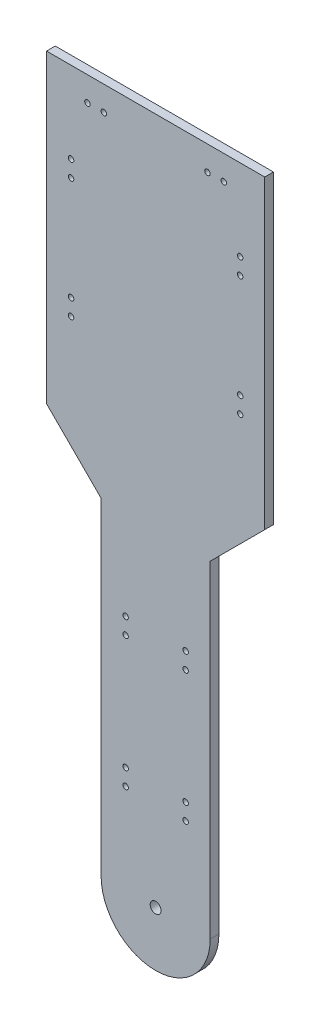
ISO-10303-21;
HEADER;
FILE_DESCRIPTION(('STEP AP214'),'2;1');
FILE_NAME('part.step','',(''),(''),'','','');
FILE_SCHEMA(('AUTOMOTIVE_DESIGN { 1 0 10303 214 1 1 1 1 }'));
ENDSEC;
DATA;
#1=APPLICATION_CONTEXT('core data for automotive mechanical design processes');
#2=APPLICATION_PROTOCOL_DEFINITION('international standard','automotive_design',2000,#1);
#3=PRODUCT_CONTEXT('',#1,'mechanical');
#4=PRODUCT('Part','Part','',(#3));
#5=PRODUCT_RELATED_PRODUCT_CATEGORY('part','',(#4));
#6=PRODUCT_DEFINITION_FORMATION('','',#4);
#7=PRODUCT_DEFINITION_CONTEXT('part definition',#1,'design');
#8=PRODUCT_DEFINITION('design','',#6,#7);
#9=PRODUCT_DEFINITION_SHAPE('','',#8);
#10=(LENGTH_UNIT() NAMED_UNIT(*) SI_UNIT(.MILLI.,.METRE.));
#11=(NAMED_UNIT(*) PLANE_ANGLE_UNIT() SI_UNIT($,.RADIAN.));
#12=(NAMED_UNIT(*) SI_UNIT($,.STERADIAN.) SOLID_ANGLE_UNIT());
#13=UNCERTAINTY_MEASURE_WITH_UNIT(LENGTH_MEASURE(1.E-05),#10,'distance_accuracy_value','');
#14=(GEOMETRIC_REPRESENTATION_CONTEXT(3) GLOBAL_UNCERTAINTY_ASSIGNED_CONTEXT((#13)) GLOBAL_UNIT_ASSIGNED_CONTEXT((#10,
#11,#12)) REPRESENTATION_CONTEXT('',''));
#15=CARTESIAN_POINT('',(0.,0.,0.));
#16=DIRECTION('',(0.,0.,1.));
#17=DIRECTION('',(1.,0.,0.));
#18=AXIS2_PLACEMENT_3D('',#15,#16,#17);
#19=CARTESIAN_POINT('',(1.27356325489975E-13,-530.,8.));
#20=DIRECTION('',(0.,0.,1.));
#21=DIRECTION('',(1.,0.,0.));
#22=AXIS2_PLACEMENT_3D('',#19,#20,#21);
#23=PLANE('',#22);
#24=CARTESIAN_POINT('',(27.5000000000038,-447.500000000005,7.99999999999908));
#25=DIRECTION('',(0.,0.,1.));
#26=DIRECTION('',(-1.,0.,0.));
#27=AXIS2_PLACEMENT_3D('',#24,#25,#26);
#28=CIRCLE('',#27,2.50000000000002);
#29=CARTESIAN_POINT('',(25.0000000000037,-447.500000000005,7.99999999999908));
#30=VERTEX_POINT('',#29);
#31=EDGE_CURVE('E303',#30,#30,#28,.T.);
#32=ORIENTED_EDGE('',*,*,#31,.F.);
#33=EDGE_LOOP('',(#32));
#34=FACE_BOUND('',#33,.T.);
#35=CARTESIAN_POINT('',(27.5000000000037,-432.500000000005,7.99999999999906));
#36=DIRECTION('',(0.,0.,1.));
#37=DIRECTION('',(-1.,0.,0.));
#38=AXIS2_PLACEMENT_3D('',#35,#36,#37);
#39=CIRCLE('',#38,2.49999999999997);
#40=CARTESIAN_POINT('',(25.0000000000038,-432.500000000005,7.99999999999906));
#41=VERTEX_POINT('',#40);
#42=EDGE_CURVE('E297',#41,#41,#39,.T.);
#43=ORIENTED_EDGE('',*,*,#42,.F.);
#44=EDGE_LOOP('',(#43));
#45=FACE_BOUND('',#44,.T.);
#46=CARTESIAN_POINT('',(77.5000000000024,-84.5000000000026,7.99999999999908));
#47=DIRECTION('',(0.,0.,1.));
#48=DIRECTION('',(-1.,0.,0.));
#49=AXIS2_PLACEMENT_3D('',#46,#47,#48);
#50=CIRCLE('',#49,2.50000000000005);
#51=CARTESIAN_POINT('',(75.0000000000024,-84.5000000000026,7.99999999999908));
#52=VERTEX_POINT('',#51);
#53=EDGE_CURVE('E291',#52,#52,#50,.T.);
#54=ORIENTED_EDGE('',*,*,#53,.F.);
#55=EDGE_LOOP('',(#54));
#56=FACE_BOUND('',#55,.T.);
#57=CARTESIAN_POINT('',(77.5000000000024,-99.5000000000026,7.9999999999991));
#58=DIRECTION('',(0.,0.,1.));
#59=DIRECTION('',(-1.,0.,0.));
#60=AXIS2_PLACEMENT_3D('',#57,#58,#59);
#61=CIRCLE('',#60,2.49999999999994);
#62=CARTESIAN_POINT('',(75.0000000000025,-99.5000000000026,7.9999999999991));
#63=VERTEX_POINT('',#62);
#64=EDGE_CURVE('E285',#63,#63,#61,.T.);
#65=ORIENTED_EDGE('',*,*,#64,.F.);
#66=EDGE_LOOP('',(#65));
#67=FACE_BOUND('',#66,.T.);
#68=CARTESIAN_POINT('',(-27.4999999999957,-432.500000000004,7.99999999999906));
#69=DIRECTION('',(0.,0.,1.));
#70=DIRECTION('',(-1.,0.,0.));
#71=AXIS2_PLACEMENT_3D('',#68,#69,#70);
#72=CIRCLE('',#71,2.49999999999997);
#73=CARTESIAN_POINT('',(-29.9999999999957,-432.500000000004,7.99999999999906));
#74=VERTEX_POINT('',#73);
#75=EDGE_CURVE('E274',#74,#74,#72,.T.);
#76=ORIENTED_EDGE('',*,*,#75,.F.);
#77=EDGE_LOOP('',(#76));
#78=FACE_BOUND('',#77,.T.);
#79=CARTESIAN_POINT('',(-27.4999999999956,-447.500000000004,7.99999999999908));
#80=DIRECTION('',(0.,0.,1.));
#81=DIRECTION('',(-1.,0.,0.));
#82=AXIS2_PLACEMENT_3D('',#79,#80,#81);
#83=CIRCLE('',#82,2.50000000000004);
#84=CARTESIAN_POINT('',(-29.9999999999957,-447.500000000004,7.99999999999908));
#85=VERTEX_POINT('',#84);
#86=EDGE_CURVE('E268',#85,#85,#83,.T.);
#87=ORIENTED_EDGE('',*,*,#86,.F.);
#88=EDGE_LOOP('',(#87));
#89=FACE_BOUND('',#88,.T.);
#90=CARTESIAN_POINT('',(-27.4999999999958,-327.499999999996,7.999999999999));
#91=DIRECTION('',(0.,0.,-1.));
#92=DIRECTION('',(-1.,0.,0.));
#93=AXIS2_PLACEMENT_3D('',#90,#91,#92);
#94=CIRCLE('',#93,2.49999999999997);
#95=CARTESIAN_POINT('',(-29.9999999999958,-327.499999999996,7.999999999999));
#96=VERTEX_POINT('',#95);
#97=EDGE_CURVE('E262',#96,#96,#94,.T.);
#98=ORIENTED_EDGE('',*,*,#97,.T.);
#99=EDGE_LOOP('',(#98));
#100=FACE_BOUND('',#99,.T.);
#101=CARTESIAN_POINT('',(-27.4999999999958,-312.499999999996,7.999999999999));
#102=DIRECTION('',(0.,0.,-1.));
#103=DIRECTION('',(-1.,0.,0.));
#104=AXIS2_PLACEMENT_3D('',#101,#102,#103);
#105=CIRCLE('',#104,2.50000000000004);
#106=CARTESIAN_POINT('',(-29.9999999999958,-312.499999999996,7.999999999999));
#107=VERTEX_POINT('',#106);
#108=EDGE_CURVE('E256',#107,#107,#105,.T.);
#109=ORIENTED_EDGE('',*,*,#108,.T.);
#110=EDGE_LOOP('',(#109));
#111=FACE_BOUND('',#110,.T.);
#112=CARTESIAN_POINT('',(-77.4999999999967,-84.5000000000027,7.99999999999908));
#113=DIRECTION('',(0.,0.,1.));
#114=DIRECTION('',(-1.,0.,0.));
#115=AXIS2_PLACEMENT_3D('',#112,#113,#114);
#116=CIRCLE('',#115,2.49999999999997);
#117=CARTESIAN_POINT('',(-79.9999999999966,-84.5000000000027,7.99999999999908));
#118=VERTEX_POINT('',#117);
#119=EDGE_CURVE('E250',#118,#118,#116,.T.);
#120=ORIENTED_EDGE('',*,*,#119,.F.);
#121=EDGE_LOOP('',(#120));
#122=FACE_BOUND('',#121,.T.);
#123=CARTESIAN_POINT('',(-77.4999999999966,-99.5000000000027,7.9999999999991));
#124=DIRECTION('',(0.,0.,1.));
#125=DIRECTION('',(-1.,0.,0.));
#126=AXIS2_PLACEMENT_3D('',#123,#124,#125);
#127=CIRCLE('',#126,2.50000000000001);
#128=CARTESIAN_POINT('',(-79.9999999999966,-99.5000000000027,7.9999999999991));
#129=VERTEX_POINT('',#128);
#130=EDGE_CURVE('E244',#129,#129,#127,.T.);
#131=ORIENTED_EDGE('',*,*,#130,.F.);
#132=EDGE_LOOP('',(#131));
#133=FACE_BOUND('',#132,.T.);
#134=CARTESIAN_POINT('',(-77.4999999999967,10.5000000000063,7.999999999999));
#135=DIRECTION('',(0.,0.,-1.));
#136=DIRECTION('',(-1.,0.,0.));
#137=AXIS2_PLACEMENT_3D('',#134,#135,#136);
#138=CIRCLE('',#137,2.49999999999997);
#139=CARTESIAN_POINT('',(-79.9999999999967,10.5000000000063,7.999999999999));
#140=VERTEX_POINT('',#139);
#141=EDGE_CURVE('E238',#140,#140,#138,.T.);
#142=ORIENTED_EDGE('',*,*,#141,.T.);
#143=EDGE_LOOP('',(#142));
#144=FACE_BOUND('',#143,.T.);
#145=CARTESIAN_POINT('',(-77.4999999999966,25.5000000000064,7.999999999999));
#146=DIRECTION('',(0.,0.,-1.));
#147=DIRECTION('',(-1.,0.,0.));
#148=AXIS2_PLACEMENT_3D('',#145,#146,#147);
#149=CIRCLE('',#148,2.50000000000001);
#150=CARTESIAN_POINT('',(-79.9999999999966,25.5000000000064,7.999999999999));
#151=VERTEX_POINT('',#150);
#152=EDGE_CURVE('E232',#151,#151,#149,.T.);
#153=ORIENTED_EDGE('',*,*,#152,.T.);
#154=EDGE_LOOP('',(#153));
#155=FACE_BOUND('',#154,.T.);
#156=CARTESIAN_POINT('',(-62.4999999999976,77.5000000000064,7.999999999999));
#157=DIRECTION('',(0.,0.,-1.));
#158=DIRECTION('',(-1.,0.,0.));
#159=AXIS2_PLACEMENT_3D('',#156,#157,#158);
#160=CIRCLE('',#159,2.50000000000004);
#161=CARTESIAN_POINT('',(-64.9999999999976,77.5000000000064,7.999999999999));
#162=VERTEX_POINT('',#161);
#163=EDGE_CURVE('E226',#162,#162,#160,.T.);
#164=ORIENTED_EDGE('',*,*,#163,.T.);
#165=EDGE_LOOP('',(#164));
#166=FACE_BOUND('',#165,.T.);
#167=CARTESIAN_POINT('',(-47.4999999999977,77.5000000000065,7.999999999999));
#168=DIRECTION('',(0.,0.,-1.));
#169=DIRECTION('',(-1.,0.,0.));
#170=AXIS2_PLACEMENT_3D('',#167,#168,#169);
#171=CIRCLE('',#170,2.49999999999997);
#172=CARTESIAN_POINT('',(-49.9999999999976,77.5000000000065,7.999999999999));
#173=VERTEX_POINT('',#172);
#174=EDGE_CURVE('E220',#173,#173,#171,.T.);
#175=ORIENTED_EDGE('',*,*,#174,.T.);
#176=EDGE_LOOP('',(#175));
#177=FACE_BOUND('',#176,.T.);
#178=CARTESIAN_POINT('',(27.5000000000036,-312.499999999994,7.999999999999));
#179=DIRECTION('',(0.,0.,-1.));
#180=DIRECTION('',(-1.,0.,0.));
#181=AXIS2_PLACEMENT_3D('',#178,#179,#180);
#182=CIRCLE('',#181,2.50000000000002);
#183=CARTESIAN_POINT('',(25.0000000000036,-312.499999999994,7.999999999999));
#184=VERTEX_POINT('',#183);
#185=EDGE_CURVE('E214',#184,#184,#182,.T.);
#186=ORIENTED_EDGE('',*,*,#185,.T.);
#187=EDGE_LOOP('',(#186));
#188=FACE_BOUND('',#187,.T.);
#189=CARTESIAN_POINT('',(27.5000000000036,-327.499999999994,7.999999999999));
#190=DIRECTION('',(0.,0.,-1.));
#191=DIRECTION('',(-1.,0.,0.));
#192=AXIS2_PLACEMENT_3D('',#189,#190,#191);
#193=CIRCLE('',#192,2.49999999999997);
#194=CARTESIAN_POINT('',(25.0000000000037,-327.499999999994,7.999999999999));
#195=VERTEX_POINT('',#194);
#196=EDGE_CURVE('E208',#195,#195,#193,.T.);
#197=ORIENTED_EDGE('',*,*,#196,.T.);
#198=EDGE_LOOP('',(#197));
#199=FACE_BOUND('',#198,.T.);
#200=CARTESIAN_POINT('',(77.5000000000024,10.5000000000063,7.999999999999));
#201=DIRECTION('',(0.,0.,-1.));
#202=DIRECTION('',(-1.,0.,0.));
#203=AXIS2_PLACEMENT_3D('',#200,#201,#202);
#204=CIRCLE('',#203,2.50000000000005);
#205=CARTESIAN_POINT('',(75.0000000000023,10.5000000000063,7.999999999999));
#206=VERTEX_POINT('',#205);
#207=EDGE_CURVE('E202',#206,#206,#204,.T.);
#208=ORIENTED_EDGE('',*,*,#207,.T.);
#209=EDGE_LOOP('',(#208));
#210=FACE_BOUND('',#209,.T.);
#211=CARTESIAN_POINT('',(77.5000000000024,25.5000000000064,7.999999999999));
#212=DIRECTION('',(0.,0.,-1.));
#213=DIRECTION('',(-1.,0.,0.));
#214=AXIS2_PLACEMENT_3D('',#211,#212,#213);
#215=CIRCLE('',#214,2.49999999999994);
#216=CARTESIAN_POINT('',(75.0000000000025,25.5000000000064,7.999999999999));
#217=VERTEX_POINT('',#216);
#218=EDGE_CURVE('E196',#217,#217,#215,.T.);
#219=ORIENTED_EDGE('',*,*,#218,.T.);
#220=EDGE_LOOP('',(#219));
#221=FACE_BOUND('',#220,.T.);
#222=CARTESIAN_POINT('',(47.5000000000039,77.5000000000053,7.999999999999));
#223=DIRECTION('',(0.,0.,-1.));
#224=DIRECTION('',(-1.,0.,0.));
#225=AXIS2_PLACEMENT_3D('',#222,#223,#224);
#226=CIRCLE('',#225,2.49999999999997);
#227=CARTESIAN_POINT('',(45.000000000004,77.5000000000053,7.999999999999));
#228=VERTEX_POINT('',#227);
#229=EDGE_CURVE('E190',#228,#228,#226,.T.);
#230=ORIENTED_EDGE('',*,*,#229,.T.);
#231=EDGE_LOOP('',(#230));
#232=FACE_BOUND('',#231,.T.);
#233=CARTESIAN_POINT('',(62.5000000000038,77.5000000000053,7.999999999999));
#234=DIRECTION('',(0.,0.,-1.));
#235=DIRECTION('',(-1.,0.,0.));
#236=AXIS2_PLACEMENT_3D('',#233,#234,#235);
#237=CIRCLE('',#236,2.49999999999997);
#238=CARTESIAN_POINT('',(60.0000000000039,77.5000000000053,7.999999999999));
#239=VERTEX_POINT('',#238);
#240=EDGE_CURVE('E184',#239,#239,#237,.T.);
#241=ORIENTED_EDGE('',*,*,#240,.T.);
#242=EDGE_LOOP('',(#241));
#243=FACE_BOUND('',#242,.T.);
#244=DIRECTION('',(0.,-1.,0.));
#245=VECTOR('',#244,1.);
#246=CARTESIAN_POINT('',(-100.,100.,8.));
#247=LINE('',#246,#245);
#248=CARTESIAN_POINT('',(-100.,100.,8.));
#249=VERTEX_POINT('',#248);
#250=CARTESIAN_POINT('',(-99.9999999999999,-180.,8.));
#251=VERTEX_POINT('',#250);
#252=EDGE_CURVE('E92',#249,#251,#247,.T.);
#253=ORIENTED_EDGE('',*,*,#252,.T.);
#254=DIRECTION('',(0.707106781186549,-0.707106781186546,0.));
#255=VECTOR('',#254,1.);
#256=CARTESIAN_POINT('',(-99.9999999999999,-180.,8.));
#257=LINE('',#256,#255);
#258=CARTESIAN_POINT('',(-50.,-230.,8.));
#259=VERTEX_POINT('',#258);
#260=EDGE_CURVE('E178',#251,#259,#257,.T.);
#261=ORIENTED_EDGE('',*,*,#260,.T.);
#262=DIRECTION('',(0.,-1.,0.));
#263=VECTOR('',#262,1.);
#264=CARTESIAN_POINT('',(-50.,-230.,8.));
#265=LINE('',#264,#263);
#266=CARTESIAN_POINT('',(-49.9999999999999,-530.,8.));
#267=VERTEX_POINT('',#266);
#268=EDGE_CURVE('E161',#259,#267,#265,.T.);
#269=ORIENTED_EDGE('',*,*,#268,.T.);
#270=CARTESIAN_POINT('',(1.27356325489975E-13,-530.,8.));
#271=DIRECTION('',(0.,0.,1.));
#272=DIRECTION('',(1.,0.,0.));
#273=AXIS2_PLACEMENT_3D('',#270,#271,#272);
#274=CIRCLE('',#273,49.9999999999999);
#275=CARTESIAN_POINT('',(50.,-530.,8.));
#276=VERTEX_POINT('',#275);
#277=EDGE_CURVE('E174',#267,#276,#274,.T.);
#278=ORIENTED_EDGE('',*,*,#277,.T.);
#279=DIRECTION('',(0.,1.,0.));
#280=VECTOR('',#279,1.);
#281=CARTESIAN_POINT('',(49.9999999999999,-230.,8.));
#282=LINE('',#281,#280);
#283=CARTESIAN_POINT('',(49.9999999999999,-230.,8.));
#284=VERTEX_POINT('',#283);
#285=EDGE_CURVE('E112',#276,#284,#282,.T.);
#286=ORIENTED_EDGE('',*,*,#285,.T.);
#287=DIRECTION('',(0.707106781186549,0.707106781186546,0.));
#288=VECTOR('',#287,1.);
#289=CARTESIAN_POINT('',(100.,-180.,8.));
#290=LINE('',#289,#288);
#291=CARTESIAN_POINT('',(100.,-180.,8.));
#292=VERTEX_POINT('',#291);
#293=EDGE_CURVE('E106',#284,#292,#290,.T.);
#294=ORIENTED_EDGE('',*,*,#293,.T.);
#295=DIRECTION('',(0.,1.,0.));
#296=VECTOR('',#295,1.);
#297=CARTESIAN_POINT('',(100.,0.,8.));
#298=LINE('',#297,#296);
#299=CARTESIAN_POINT('',(100.,100.,8.));
#300=VERTEX_POINT('',#299);
#301=EDGE_CURVE('E110',#292,#300,#298,.T.);
#302=ORIENTED_EDGE('',*,*,#301,.T.);
#303=DIRECTION('',(-1.,0.,0.));
#304=VECTOR('',#303,1.);
#305=CARTESIAN_POINT('',(-100.,100.,8.));
#306=LINE('',#305,#304);
#307=EDGE_CURVE('E51',#300,#249,#306,.T.);
#308=ORIENTED_EDGE('',*,*,#307,.T.);
#309=EDGE_LOOP('',(#253,#261,#269,#278,#286,#294,#302,#308));
#310=FACE_BOUND('',#309,.T.);
#311=CARTESIAN_POINT('',(1.27356325489975E-13,-530.,8.));
#312=DIRECTION('',(0.,0.,1.));
#313=DIRECTION('',(1.,0.,0.));
#314=AXIS2_PLACEMENT_3D('',#311,#312,#313);
#315=CIRCLE('',#314,5.);
#316=CARTESIAN_POINT('',(5.00000000000013,-530.,8.));
#317=VERTEX_POINT('',#316);
#318=EDGE_CURVE('E133',#317,#317,#315,.T.);
#319=ORIENTED_EDGE('',*,*,#318,.F.);
#320=EDGE_LOOP('',(#319));
#321=FACE_BOUND('',#320,.T.);
#322=ADVANCED_FACE('F34',(#34,#45,#56,#67,#78,#89,#100,#111,#122,#133,#144,#155,#166,#177,#188,
#199,#210,#221,#232,#243,#310,#321),#23,.T.);
#323=CARTESIAN_POINT('',(1.27356325489975E-13,-530.,0.));
#324=DIRECTION('',(0.,0.,1.));
#325=DIRECTION('',(1.,0.,0.));
#326=AXIS2_PLACEMENT_3D('',#323,#324,#325);
#327=PLANE('',#326);
#328=CARTESIAN_POINT('',(27.5000000000038,-447.500000000005,-9.16649688174876E-13));
#329=DIRECTION('',(0.,0.,1.));
#330=DIRECTION('',(-1.,0.,0.));
#331=AXIS2_PLACEMENT_3D('',#328,#329,#330);
#332=CIRCLE('',#331,2.50000000000002);
#333=CARTESIAN_POINT('',(25.0000000000037,-447.500000000005,-9.16649688174876E-13));
#334=VERTEX_POINT('',#333);
#335=EDGE_CURVE('E300',#334,#334,#332,.T.);
#336=ORIENTED_EDGE('',*,*,#335,.T.);
#337=EDGE_LOOP('',(#336));
#338=FACE_BOUND('',#337,.T.);
#339=CARTESIAN_POINT('',(27.5000000000037,-432.500000000005,-9.34994362394378E-13));
#340=DIRECTION('',(0.,0.,1.));
#341=DIRECTION('',(-1.,0.,0.));
#342=AXIS2_PLACEMENT_3D('',#339,#340,#341);
#343=CIRCLE('',#342,2.49999999999997);
#344=CARTESIAN_POINT('',(25.0000000000038,-432.500000000005,-9.34994362394378E-13));
#345=VERTEX_POINT('',#344);
#346=EDGE_CURVE('E294',#345,#345,#343,.T.);
#347=ORIENTED_EDGE('',*,*,#346,.T.);
#348=EDGE_LOOP('',(#347));
#349=FACE_BOUND('',#348,.T.);
#350=CARTESIAN_POINT('',(77.5000000000024,-84.5000000000026,-9.21558102653945E-13));
#351=DIRECTION('',(0.,0.,1.));
#352=DIRECTION('',(-1.,0.,0.));
#353=AXIS2_PLACEMENT_3D('',#350,#351,#352);
#354=CIRCLE('',#353,2.50000000000005);
#355=CARTESIAN_POINT('',(75.0000000000024,-84.5000000000026,-9.21558102653945E-13));
#356=VERTEX_POINT('',#355);
#357=EDGE_CURVE('E288',#356,#356,#354,.T.);
#358=ORIENTED_EDGE('',*,*,#357,.T.);
#359=EDGE_LOOP('',(#358));
#360=FACE_BOUND('',#359,.T.);
#361=CARTESIAN_POINT('',(77.5000000000024,-99.5000000000026,-8.97039380703833E-13));
#362=DIRECTION('',(0.,0.,1.));
#363=DIRECTION('',(-1.,0.,0.));
#364=AXIS2_PLACEMENT_3D('',#361,#362,#363);
#365=CIRCLE('',#364,2.49999999999994);
#366=CARTESIAN_POINT('',(75.0000000000025,-99.5000000000026,-8.97039380703833E-13));
#367=VERTEX_POINT('',#366);
#368=EDGE_CURVE('E280',#367,#367,#365,.T.);
#369=ORIENTED_EDGE('',*,*,#368,.T.);
#370=EDGE_LOOP('',(#369));
#371=FACE_BOUND('',#370,.T.);
#372=CARTESIAN_POINT('',(-27.4999999999957,-432.500000000004,-9.34994362394379E-13));
#373=DIRECTION('',(0.,0.,1.));
#374=DIRECTION('',(-1.,0.,0.));
#375=AXIS2_PLACEMENT_3D('',#372,#373,#374);
#376=CIRCLE('',#375,2.49999999999997);
#377=CARTESIAN_POINT('',(-29.9999999999957,-432.500000000004,-9.34994362394379E-13));
#378=VERTEX_POINT('',#377);
#379=EDGE_CURVE('E277',#378,#378,#376,.T.);
#380=ORIENTED_EDGE('',*,*,#379,.T.);
#381=EDGE_LOOP('',(#380));
#382=FACE_BOUND('',#381,.T.);
#383=CARTESIAN_POINT('',(-27.4999999999956,-447.500000000004,-9.16649688174878E-13));
#384=DIRECTION('',(0.,0.,1.));
#385=DIRECTION('',(-1.,0.,0.));
#386=AXIS2_PLACEMENT_3D('',#383,#384,#385);
#387=CIRCLE('',#386,2.50000000000004);
#388=CARTESIAN_POINT('',(-29.9999999999957,-447.500000000004,-9.16649688174878E-13));
#389=VERTEX_POINT('',#388);
#390=EDGE_CURVE('E271',#389,#389,#387,.T.);
#391=ORIENTED_EDGE('',*,*,#390,.T.);
#392=EDGE_LOOP('',(#391));
#393=FACE_BOUND('',#392,.T.);
#394=CARTESIAN_POINT('',(-27.4999999999958,-327.499999999996,-9.99200722162641E-13));
#395=DIRECTION('',(0.,0.,-1.));
#396=DIRECTION('',(-1.,0.,0.));
#397=AXIS2_PLACEMENT_3D('',#394,#395,#396);
#398=CIRCLE('',#397,2.49999999999997);
#399=CARTESIAN_POINT('',(-29.9999999999958,-327.499999999996,-9.99200722162641E-13));
#400=VERTEX_POINT('',#399);
#401=EDGE_CURVE('E265',#400,#400,#398,.T.);
#402=ORIENTED_EDGE('',*,*,#401,.F.);
#403=EDGE_LOOP('',(#402));
#404=FACE_BOUND('',#403,.T.);
#405=CARTESIAN_POINT('',(-27.4999999999958,-312.499999999996,-9.99200722162641E-13));
#406=DIRECTION('',(0.,0.,-1.));
#407=DIRECTION('',(-1.,0.,0.));
#408=AXIS2_PLACEMENT_3D('',#405,#406,#407);
#409=CIRCLE('',#408,2.50000000000004);
#410=CARTESIAN_POINT('',(-29.9999999999958,-312.499999999996,-9.99200722162641E-13));
#411=VERTEX_POINT('',#410);
#412=EDGE_CURVE('E259',#411,#411,#409,.T.);
#413=ORIENTED_EDGE('',*,*,#412,.F.);
#414=EDGE_LOOP('',(#413));
#415=FACE_BOUND('',#414,.T.);
#416=CARTESIAN_POINT('',(-77.4999999999967,-84.5000000000027,-9.21558102653945E-13));
#417=DIRECTION('',(0.,0.,1.));
#418=DIRECTION('',(-1.,0.,0.));
#419=AXIS2_PLACEMENT_3D('',#416,#417,#418);
#420=CIRCLE('',#419,2.49999999999997);
#421=CARTESIAN_POINT('',(-79.9999999999966,-84.5000000000027,-9.21558102653945E-13));
#422=VERTEX_POINT('',#421);
#423=EDGE_CURVE('E253',#422,#422,#420,.T.);
#424=ORIENTED_EDGE('',*,*,#423,.T.);
#425=EDGE_LOOP('',(#424));
#426=FACE_BOUND('',#425,.T.);
#427=CARTESIAN_POINT('',(-77.4999999999966,-99.5000000000027,-8.97039380703833E-13));
#428=DIRECTION('',(0.,0.,1.));
#429=DIRECTION('',(-1.,0.,0.));
#430=AXIS2_PLACEMENT_3D('',#427,#428,#429);
#431=CIRCLE('',#430,2.50000000000001);
#432=CARTESIAN_POINT('',(-79.9999999999966,-99.5000000000027,-8.97039380703833E-13));
#433=VERTEX_POINT('',#432);
#434=EDGE_CURVE('E247',#433,#433,#431,.T.);
#435=ORIENTED_EDGE('',*,*,#434,.T.);
#436=EDGE_LOOP('',(#435));
#437=FACE_BOUND('',#436,.T.);
#438=CARTESIAN_POINT('',(-77.4999999999967,10.5000000000063,-9.99200722162641E-13));
#439=DIRECTION('',(0.,0.,-1.));
#440=DIRECTION('',(-1.,0.,0.));
#441=AXIS2_PLACEMENT_3D('',#438,#439,#440);
#442=CIRCLE('',#441,2.49999999999997);
#443=CARTESIAN_POINT('',(-79.9999999999967,10.5000000000063,-9.99200722162641E-13));
#444=VERTEX_POINT('',#443);
#445=EDGE_CURVE('E241',#444,#444,#442,.T.);
#446=ORIENTED_EDGE('',*,*,#445,.F.);
#447=EDGE_LOOP('',(#446));
#448=FACE_BOUND('',#447,.T.);
#449=CARTESIAN_POINT('',(-77.4999999999966,25.5000000000064,-9.99200722162641E-13));
#450=DIRECTION('',(0.,0.,-1.));
#451=DIRECTION('',(-1.,0.,0.));
#452=AXIS2_PLACEMENT_3D('',#449,#450,#451);
#453=CIRCLE('',#452,2.50000000000001);
#454=CARTESIAN_POINT('',(-79.9999999999966,25.5000000000064,-9.99200722162641E-13));
#455=VERTEX_POINT('',#454);
#456=EDGE_CURVE('E235',#455,#455,#453,.T.);
#457=ORIENTED_EDGE('',*,*,#456,.F.);
#458=EDGE_LOOP('',(#457));
#459=FACE_BOUND('',#458,.T.);
#460=CARTESIAN_POINT('',(-62.4999999999976,77.5000000000064,-9.99200722162641E-13));
#461=DIRECTION('',(0.,0.,-1.));
#462=DIRECTION('',(-1.,0.,0.));
#463=AXIS2_PLACEMENT_3D('',#460,#461,#462);
#464=CIRCLE('',#463,2.50000000000004);
#465=CARTESIAN_POINT('',(-64.9999999999976,77.5000000000064,-9.99200722162641E-13));
#466=VERTEX_POINT('',#465);
#467=EDGE_CURVE('E229',#466,#466,#464,.T.);
#468=ORIENTED_EDGE('',*,*,#467,.F.);
#469=EDGE_LOOP('',(#468));
#470=FACE_BOUND('',#469,.T.);
#471=CARTESIAN_POINT('',(-47.4999999999977,77.5000000000065,-9.99200722162641E-13));
#472=DIRECTION('',(0.,0.,-1.));
#473=DIRECTION('',(-1.,0.,0.));
#474=AXIS2_PLACEMENT_3D('',#471,#472,#473);
#475=CIRCLE('',#474,2.49999999999997);
#476=CARTESIAN_POINT('',(-49.9999999999976,77.5000000000065,-9.99200722162641E-13));
#477=VERTEX_POINT('',#476);
#478=EDGE_CURVE('E223',#477,#477,#475,.T.);
#479=ORIENTED_EDGE('',*,*,#478,.F.);
#480=EDGE_LOOP('',(#479));
#481=FACE_BOUND('',#480,.T.);
#482=CARTESIAN_POINT('',(27.5000000000036,-312.499999999994,-9.99200722162641E-13));
#483=DIRECTION('',(0.,0.,-1.));
#484=DIRECTION('',(-1.,0.,0.));
#485=AXIS2_PLACEMENT_3D('',#482,#483,#484);
#486=CIRCLE('',#485,2.50000000000002);
#487=CARTESIAN_POINT('',(25.0000000000036,-312.499999999994,-9.99200722162641E-13));
#488=VERTEX_POINT('',#487);
#489=EDGE_CURVE('E217',#488,#488,#486,.T.);
#490=ORIENTED_EDGE('',*,*,#489,.F.);
#491=EDGE_LOOP('',(#490));
#492=FACE_BOUND('',#491,.T.);
#493=CARTESIAN_POINT('',(27.5000000000036,-327.499999999994,-9.99200722162641E-13));
#494=DIRECTION('',(0.,0.,-1.));
#495=DIRECTION('',(-1.,0.,0.));
#496=AXIS2_PLACEMENT_3D('',#493,#494,#495);
#497=CIRCLE('',#496,2.49999999999997);
#498=CARTESIAN_POINT('',(25.0000000000037,-327.499999999994,-9.99200722162641E-13));
#499=VERTEX_POINT('',#498);
#500=EDGE_CURVE('E211',#499,#499,#497,.T.);
#501=ORIENTED_EDGE('',*,*,#500,.F.);
#502=EDGE_LOOP('',(#501));
#503=FACE_BOUND('',#502,.T.);
#504=CARTESIAN_POINT('',(77.5000000000024,10.5000000000063,-9.99200722162641E-13));
#505=DIRECTION('',(0.,0.,-1.));
#506=DIRECTION('',(-1.,0.,0.));
#507=AXIS2_PLACEMENT_3D('',#504,#505,#506);
#508=CIRCLE('',#507,2.50000000000005);
#509=CARTESIAN_POINT('',(75.0000000000023,10.5000000000063,-9.99200722162641E-13));
#510=VERTEX_POINT('',#509);
#511=EDGE_CURVE('E205',#510,#510,#508,.T.);
#512=ORIENTED_EDGE('',*,*,#511,.F.);
#513=EDGE_LOOP('',(#512));
#514=FACE_BOUND('',#513,.T.);
#515=CARTESIAN_POINT('',(77.5000000000024,25.5000000000064,-9.99200722162641E-13));
#516=DIRECTION('',(0.,0.,-1.));
#517=DIRECTION('',(-1.,0.,0.));
#518=AXIS2_PLACEMENT_3D('',#515,#516,#517);
#519=CIRCLE('',#518,2.49999999999994);
#520=CARTESIAN_POINT('',(75.0000000000025,25.5000000000064,-9.99200722162641E-13));
#521=VERTEX_POINT('',#520);
#522=EDGE_CURVE('E199',#521,#521,#519,.T.);
#523=ORIENTED_EDGE('',*,*,#522,.F.);
#524=EDGE_LOOP('',(#523));
#525=FACE_BOUND('',#524,.T.);
#526=CARTESIAN_POINT('',(47.5000000000039,77.5000000000053,-9.99200722162641E-13));
#527=DIRECTION('',(0.,0.,-1.));
#528=DIRECTION('',(-1.,0.,0.));
#529=AXIS2_PLACEMENT_3D('',#526,#527,#528);
#530=CIRCLE('',#529,2.49999999999997);
#531=CARTESIAN_POINT('',(45.000000000004,77.5000000000053,-9.99200722162641E-13));
#532=VERTEX_POINT('',#531);
#533=EDGE_CURVE('E193',#532,#532,#530,.T.);
#534=ORIENTED_EDGE('',*,*,#533,.F.);
#535=EDGE_LOOP('',(#534));
#536=FACE_BOUND('',#535,.T.);
#537=CARTESIAN_POINT('',(62.5000000000038,77.5000000000053,-9.99200722162641E-13));
#538=DIRECTION('',(0.,0.,-1.));
#539=DIRECTION('',(-1.,0.,0.));
#540=AXIS2_PLACEMENT_3D('',#537,#538,#539);
#541=CIRCLE('',#540,2.49999999999997);
#542=CARTESIAN_POINT('',(60.0000000000039,77.5000000000053,-9.99200722162641E-13));
#543=VERTEX_POINT('',#542);
#544=EDGE_CURVE('E187',#543,#543,#541,.T.);
#545=ORIENTED_EDGE('',*,*,#544,.F.);
#546=EDGE_LOOP('',(#545));
#547=FACE_BOUND('',#546,.T.);
#548=DIRECTION('',(0.,-1.,0.));
#549=VECTOR('',#548,1.);
#550=CARTESIAN_POINT('',(-99.9999999999999,0.,0.));
#551=LINE('',#550,#549);
#552=CARTESIAN_POINT('',(-100.,100.,0.));
#553=VERTEX_POINT('',#552);
#554=CARTESIAN_POINT('',(-99.9999999999999,-180.,0.));
#555=VERTEX_POINT('',#554);
#556=EDGE_CURVE('E86',#553,#555,#551,.T.);
#557=ORIENTED_EDGE('',*,*,#556,.F.);
#558=DIRECTION('',(-1.,0.,0.));
#559=VECTOR('',#558,1.);
#560=CARTESIAN_POINT('',(-100.,100.,0.));
#561=LINE('',#560,#559);
#562=CARTESIAN_POINT('',(100.,100.,0.));
#563=VERTEX_POINT('',#562);
#564=EDGE_CURVE('E143',#563,#553,#561,.T.);
#565=ORIENTED_EDGE('',*,*,#564,.F.);
#566=DIRECTION('',(0.,1.,0.));
#567=VECTOR('',#566,1.);
#568=CARTESIAN_POINT('',(100.,100.,0.));
#569=LINE('',#568,#567);
#570=CARTESIAN_POINT('',(100.,-180.,0.));
#571=VERTEX_POINT('',#570);
#572=EDGE_CURVE('E79',#571,#563,#569,.T.);
#573=ORIENTED_EDGE('',*,*,#572,.F.);
#574=DIRECTION('',(0.707106781186549,0.707106781186546,0.));
#575=VECTOR('',#574,1.);
#576=CARTESIAN_POINT('',(100.,-180.,0.));
#577=LINE('',#576,#575);
#578=CARTESIAN_POINT('',(49.9999999999999,-230.,0.));
#579=VERTEX_POINT('',#578);
#580=EDGE_CURVE('E121',#579,#571,#577,.T.);
#581=ORIENTED_EDGE('',*,*,#580,.F.);
#582=DIRECTION('',(0.,1.,0.));
#583=VECTOR('',#582,1.);
#584=CARTESIAN_POINT('',(49.9999999999999,-230.,0.));
#585=LINE('',#584,#583);
#586=CARTESIAN_POINT('',(50.,-530.,0.));
#587=VERTEX_POINT('',#586);
#588=EDGE_CURVE('E139',#587,#579,#585,.T.);
#589=ORIENTED_EDGE('',*,*,#588,.F.);
#590=CARTESIAN_POINT('',(1.27356325489975E-13,-530.,0.));
#591=DIRECTION('',(0.,0.,1.));
#592=DIRECTION('',(1.,0.,0.));
#593=AXIS2_PLACEMENT_3D('',#590,#591,#592);
#594=CIRCLE('',#593,49.9999999999999);
#595=CARTESIAN_POINT('',(-49.9999999999999,-530.,0.));
#596=VERTEX_POINT('',#595);
#597=EDGE_CURVE('E137',#596,#587,#594,.T.);
#598=ORIENTED_EDGE('',*,*,#597,.F.);
#599=DIRECTION('',(0.,-1.,0.));
#600=VECTOR('',#599,1.);
#601=CARTESIAN_POINT('',(-50.,-230.,0.));
#602=LINE('',#601,#600);
#603=CARTESIAN_POINT('',(-50.,-230.,0.));
#604=VERTEX_POINT('',#603);
#605=EDGE_CURVE('E135',#604,#596,#602,.T.);
#606=ORIENTED_EDGE('',*,*,#605,.F.);
#607=DIRECTION('',(0.707106781186549,-0.707106781186546,0.));
#608=VECTOR('',#607,1.);
#609=CARTESIAN_POINT('',(-99.9999999999999,-180.,0.));
#610=LINE('',#609,#608);
#611=EDGE_CURVE('E132',#555,#604,#610,.T.);
#612=ORIENTED_EDGE('',*,*,#611,.F.);
#613=EDGE_LOOP('',(#557,#565,#573,#581,#589,#598,#606,#612));
#614=FACE_BOUND('',#613,.T.);
#615=CARTESIAN_POINT('',(1.27356325489975E-13,-530.,0.));
#616=DIRECTION('',(0.,0.,1.));
#617=DIRECTION('',(1.,0.,0.));
#618=AXIS2_PLACEMENT_3D('',#615,#616,#617);
#619=CIRCLE('',#618,5.);
#620=CARTESIAN_POINT('',(5.00000000000013,-530.,0.));
#621=VERTEX_POINT('',#620);
#622=EDGE_CURVE('E181',#621,#621,#619,.T.);
#623=ORIENTED_EDGE('',*,*,#622,.T.);
#624=EDGE_LOOP('',(#623));
#625=FACE_BOUND('',#624,.T.);
#626=ADVANCED_FACE('F165',(#338,#349,#360,#371,#382,#393,#404,#415,#426,#437,#448,#459,#470,
#481,#492,#503,#514,#525,#536,#547,#614,#625),#327,.F.);
#627=CARTESIAN_POINT('',(-99.9999999999999,0.,8.));
#628=DIRECTION('',(1.,0.,0.));
#629=DIRECTION('',(0.,1.,0.));
#630=AXIS2_PLACEMENT_3D('',#627,#628,#629);
#631=PLANE('',#630);
#632=ORIENTED_EDGE('',*,*,#556,.T.);
#633=DIRECTION('',(0.,0.,-1.));
#634=VECTOR('',#633,1.);
#635=CARTESIAN_POINT('',(-99.9999999999999,-180.,8.));
#636=LINE('',#635,#634);
#637=EDGE_CURVE('E11',#251,#555,#636,.T.);
#638=ORIENTED_EDGE('',*,*,#637,.F.);
#639=ORIENTED_EDGE('',*,*,#252,.F.);
#640=DIRECTION('',(0.,0.,-1.));
#641=VECTOR('',#640,1.);
#642=CARTESIAN_POINT('',(-100.,100.,8.));
#643=LINE('',#642,#641);
#644=EDGE_CURVE('E127',#249,#553,#643,.T.);
#645=ORIENTED_EDGE('',*,*,#644,.T.);
#646=EDGE_LOOP('',(#632,#638,#639,#645));
#647=FACE_BOUND('',#646,.T.);
#648=ADVANCED_FACE('F36',(#647),#631,.F.);
#649=CARTESIAN_POINT('',(-99.9999999999999,-180.,8.));
#650=DIRECTION('',(0.707106781186546,0.707106781186549,0.));
#651=DIRECTION('',(-0.707106781186549,0.707106781186546,0.));
#652=AXIS2_PLACEMENT_3D('',#649,#650,#651);
#653=PLANE('',#652);
#654=ORIENTED_EDGE('',*,*,#611,.T.);
#655=DIRECTION('',(0.,0.,-1.));
#656=VECTOR('',#655,1.);
#657=CARTESIAN_POINT('',(-50.,-230.,8.));
#658=LINE('',#657,#656);
#659=EDGE_CURVE('E43',#259,#604,#658,.T.);
#660=ORIENTED_EDGE('',*,*,#659,.F.);
#661=ORIENTED_EDGE('',*,*,#260,.F.);
#662=ORIENTED_EDGE('',*,*,#637,.T.);
#663=EDGE_LOOP('',(#654,#660,#661,#662));
#664=FACE_BOUND('',#663,.T.);
#665=ADVANCED_FACE('F365',(#664),#653,.F.);
#666=CARTESIAN_POINT('',(-50.,-230.,8.));
#667=DIRECTION('',(1.,0.,0.));
#668=DIRECTION('',(0.,1.,0.));
#669=AXIS2_PLACEMENT_3D('',#666,#667,#668);
#670=PLANE('',#669);
#671=ORIENTED_EDGE('',*,*,#605,.T.);
#672=DIRECTION('',(0.,0.,-1.));
#673=VECTOR('',#672,1.);
#674=CARTESIAN_POINT('',(-49.9999999999999,-530.,8.));
#675=LINE('',#674,#673);
#676=EDGE_CURVE('E152',#267,#596,#675,.T.);
#677=ORIENTED_EDGE('',*,*,#676,.F.);
#678=ORIENTED_EDGE('',*,*,#268,.F.);
#679=ORIENTED_EDGE('',*,*,#659,.T.);
#680=EDGE_LOOP('',(#671,#677,#678,#679));
#681=FACE_BOUND('',#680,.T.);
#682=ADVANCED_FACE('F159',(#681),#670,.F.);
#683=CARTESIAN_POINT('',(1.27356325489975E-13,-530.,8.));
#684=DIRECTION('',(0.,0.,-1.));
#685=DIRECTION('',(-1.,0.,0.));
#686=AXIS2_PLACEMENT_3D('',#683,#684,#685);
#687=CYLINDRICAL_SURFACE('',#686,49.9999999999999);
#688=ORIENTED_EDGE('',*,*,#597,.T.);
#689=DIRECTION('',(0.,0.,-1.));
#690=VECTOR('',#689,1.);
#691=CARTESIAN_POINT('',(50.,-530.,8.));
#692=LINE('',#691,#690);
#693=EDGE_CURVE('E149',#276,#587,#692,.T.);
#694=ORIENTED_EDGE('',*,*,#693,.F.);
#695=ORIENTED_EDGE('',*,*,#277,.F.);
#696=ORIENTED_EDGE('',*,*,#676,.T.);
#697=EDGE_LOOP('',(#688,#694,#695,#696));
#698=FACE_BOUND('',#697,.T.);
#699=ADVANCED_FACE('F170',(#698),#687,.T.);
#700=CARTESIAN_POINT('',(49.9999999999999,-230.,8.));
#701=DIRECTION('',(-1.,0.,0.));
#702=DIRECTION('',(0.,-1.,0.));
#703=AXIS2_PLACEMENT_3D('',#700,#701,#702);
#704=PLANE('',#703);
#705=ORIENTED_EDGE('',*,*,#588,.T.);
#706=DIRECTION('',(0.,0.,-1.));
#707=VECTOR('',#706,1.);
#708=CARTESIAN_POINT('',(49.9999999999999,-230.,8.));
#709=LINE('',#708,#707);
#710=EDGE_CURVE('E122',#284,#579,#709,.T.);
#711=ORIENTED_EDGE('',*,*,#710,.F.);
#712=ORIENTED_EDGE('',*,*,#285,.F.);
#713=ORIENTED_EDGE('',*,*,#693,.T.);
#714=EDGE_LOOP('',(#705,#711,#712,#713));
#715=FACE_BOUND('',#714,.T.);
#716=ADVANCED_FACE('F173',(#715),#704,.F.);
#717=CARTESIAN_POINT('',(100.,-180.,8.));
#718=DIRECTION('',(-0.707106781186546,0.707106781186549,0.));
#719=DIRECTION('',(-0.707106781186549,-0.707106781186546,0.));
#720=AXIS2_PLACEMENT_3D('',#717,#718,#719);
#721=PLANE('',#720);
#722=ORIENTED_EDGE('',*,*,#580,.T.);
#723=DIRECTION('',(0.,0.,-1.));
#724=VECTOR('',#723,1.);
#725=CARTESIAN_POINT('',(100.,-180.,8.));
#726=LINE('',#725,#724);
#727=EDGE_CURVE('E118',#292,#571,#726,.T.);
#728=ORIENTED_EDGE('',*,*,#727,.F.);
#729=ORIENTED_EDGE('',*,*,#293,.F.);
#730=ORIENTED_EDGE('',*,*,#710,.T.);
#731=EDGE_LOOP('',(#722,#728,#729,#730));
#732=FACE_BOUND('',#731,.T.);
#733=ADVANCED_FACE('F119',(#732),#721,.F.);
#734=CARTESIAN_POINT('',(100.,100.,8.));
#735=DIRECTION('',(-1.,0.,0.));
#736=DIRECTION('',(0.,0.,1.));
#737=AXIS2_PLACEMENT_3D('',#734,#735,#736);
#738=PLANE('',#737);
#739=ORIENTED_EDGE('',*,*,#572,.T.);
#740=DIRECTION('',(0.,0.,-1.));
#741=VECTOR('',#740,1.);
#742=CARTESIAN_POINT('',(100.,100.,8.));
#743=LINE('',#742,#741);
#744=EDGE_CURVE('E123',#300,#563,#743,.T.);
#745=ORIENTED_EDGE('',*,*,#744,.F.);
#746=ORIENTED_EDGE('',*,*,#301,.F.);
#747=ORIENTED_EDGE('',*,*,#727,.T.);
#748=EDGE_LOOP('',(#739,#745,#746,#747));
#749=FACE_BOUND('',#748,.T.);
#750=ADVANCED_FACE('F125',(#749),#738,.F.);
#751=CARTESIAN_POINT('',(-100.,100.,8.));
#752=DIRECTION('',(0.,-1.,0.));
#753=DIRECTION('',(1.,0.,0.));
#754=AXIS2_PLACEMENT_3D('',#751,#752,#753);
#755=PLANE('',#754);
#756=ORIENTED_EDGE('',*,*,#564,.T.);
#757=ORIENTED_EDGE('',*,*,#644,.F.);
#758=ORIENTED_EDGE('',*,*,#307,.F.);
#759=ORIENTED_EDGE('',*,*,#744,.T.);
#760=EDGE_LOOP('',(#756,#757,#758,#759));
#761=FACE_BOUND('',#760,.T.);
#762=ADVANCED_FACE('F370',(#761),#755,.F.);
#763=CARTESIAN_POINT('',(1.27356325489975E-13,-530.,8.));
#764=DIRECTION('',(0.,0.,-1.));
#765=DIRECTION('',(-1.,0.,0.));
#766=AXIS2_PLACEMENT_3D('',#763,#764,#765);
#767=CYLINDRICAL_SURFACE('',#766,5.);
#768=ORIENTED_EDGE('',*,*,#318,.T.);
#769=EDGE_LOOP('',(#768));
#770=FACE_BOUND('',#769,.T.);
#771=ORIENTED_EDGE('',*,*,#622,.F.);
#772=EDGE_LOOP('',(#771));
#773=FACE_BOUND('',#772,.T.);
#774=ADVANCED_FACE('F355',(#770,#773),#767,.F.);
#775=CARTESIAN_POINT('',(62.5000000000038,77.5000000000053,7.999999999999));
#776=DIRECTION('',(0.,0.,-1.));
#777=DIRECTION('',(-1.,0.,0.));
#778=AXIS2_PLACEMENT_3D('',#775,#776,#777);
#779=CYLINDRICAL_SURFACE('',#778,2.49999999999997);
#780=ORIENTED_EDGE('',*,*,#240,.F.);
#781=EDGE_LOOP('',(#780));
#782=FACE_BOUND('',#781,.T.);
#783=ORIENTED_EDGE('',*,*,#544,.T.);
#784=EDGE_LOOP('',(#783));
#785=FACE_BOUND('',#784,.T.);
#786=ADVANCED_FACE('F351',(#782,#785),#779,.F.);
#787=CARTESIAN_POINT('',(47.5000000000039,77.5000000000053,7.999999999999));
#788=DIRECTION('',(0.,0.,-1.));
#789=DIRECTION('',(-1.,0.,0.));
#790=AXIS2_PLACEMENT_3D('',#787,#788,#789);
#791=CYLINDRICAL_SURFACE('',#790,2.49999999999997);
#792=ORIENTED_EDGE('',*,*,#229,.F.);
#793=EDGE_LOOP('',(#792));
#794=FACE_BOUND('',#793,.T.);
#795=ORIENTED_EDGE('',*,*,#533,.T.);
#796=EDGE_LOOP('',(#795));
#797=FACE_BOUND('',#796,.T.);
#798=ADVANCED_FACE('F354',(#794,#797),#791,.F.);
#799=CARTESIAN_POINT('',(77.5000000000024,25.5000000000064,7.999999999999));
#800=DIRECTION('',(0.,0.,-1.));
#801=DIRECTION('',(-1.,0.,0.));
#802=AXIS2_PLACEMENT_3D('',#799,#800,#801);
#803=CYLINDRICAL_SURFACE('',#802,2.49999999999994);
#804=ORIENTED_EDGE('',*,*,#218,.F.);
#805=EDGE_LOOP('',(#804));
#806=FACE_BOUND('',#805,.T.);
#807=ORIENTED_EDGE('',*,*,#522,.T.);
#808=EDGE_LOOP('',(#807));
#809=FACE_BOUND('',#808,.T.);
#810=ADVANCED_FACE('F428',(#806,#809),#803,.F.);
#811=CARTESIAN_POINT('',(77.5000000000024,10.5000000000063,7.999999999999));
#812=DIRECTION('',(0.,0.,-1.));
#813=DIRECTION('',(-1.,0.,0.));
#814=AXIS2_PLACEMENT_3D('',#811,#812,#813);
#815=CYLINDRICAL_SURFACE('',#814,2.50000000000005);
#816=ORIENTED_EDGE('',*,*,#207,.F.);
#817=EDGE_LOOP('',(#816));
#818=FACE_BOUND('',#817,.T.);
#819=ORIENTED_EDGE('',*,*,#511,.T.);
#820=EDGE_LOOP('',(#819));
#821=FACE_BOUND('',#820,.T.);
#822=ADVANCED_FACE('F436',(#818,#821),#815,.F.);
#823=CARTESIAN_POINT('',(27.5000000000036,-327.499999999994,7.999999999999));
#824=DIRECTION('',(0.,0.,-1.));
#825=DIRECTION('',(-1.,0.,0.));
#826=AXIS2_PLACEMENT_3D('',#823,#824,#825);
#827=CYLINDRICAL_SURFACE('',#826,2.49999999999997);
#828=ORIENTED_EDGE('',*,*,#196,.F.);
#829=EDGE_LOOP('',(#828));
#830=FACE_BOUND('',#829,.T.);
#831=ORIENTED_EDGE('',*,*,#500,.T.);
#832=EDGE_LOOP('',(#831));
#833=FACE_BOUND('',#832,.T.);
#834=ADVANCED_FACE('F444',(#830,#833),#827,.F.);
#835=CARTESIAN_POINT('',(27.5000000000036,-312.499999999994,7.999999999999));
#836=DIRECTION('',(0.,0.,-1.));
#837=DIRECTION('',(-1.,0.,0.));
#838=AXIS2_PLACEMENT_3D('',#835,#836,#837);
#839=CYLINDRICAL_SURFACE('',#838,2.50000000000002);
#840=ORIENTED_EDGE('',*,*,#185,.F.);
#841=EDGE_LOOP('',(#840));
#842=FACE_BOUND('',#841,.T.);
#843=ORIENTED_EDGE('',*,*,#489,.T.);
#844=EDGE_LOOP('',(#843));
#845=FACE_BOUND('',#844,.T.);
#846=ADVANCED_FACE('F452',(#842,#845),#839,.F.);
#847=CARTESIAN_POINT('',(-47.4999999999977,77.5000000000065,7.999999999999));
#848=DIRECTION('',(0.,0.,-1.));
#849=DIRECTION('',(-1.,0.,0.));
#850=AXIS2_PLACEMENT_3D('',#847,#848,#849);
#851=CYLINDRICAL_SURFACE('',#850,2.49999999999997);
#852=ORIENTED_EDGE('',*,*,#174,.F.);
#853=EDGE_LOOP('',(#852));
#854=FACE_BOUND('',#853,.T.);
#855=ORIENTED_EDGE('',*,*,#478,.T.);
#856=EDGE_LOOP('',(#855));
#857=FACE_BOUND('',#856,.T.);
#858=ADVANCED_FACE('F460',(#854,#857),#851,.F.);
#859=CARTESIAN_POINT('',(-62.4999999999976,77.5000000000064,7.999999999999));
#860=DIRECTION('',(0.,0.,-1.));
#861=DIRECTION('',(-1.,0.,0.));
#862=AXIS2_PLACEMENT_3D('',#859,#860,#861);
#863=CYLINDRICAL_SURFACE('',#862,2.50000000000004);
#864=ORIENTED_EDGE('',*,*,#163,.F.);
#865=EDGE_LOOP('',(#864));
#866=FACE_BOUND('',#865,.T.);
#867=ORIENTED_EDGE('',*,*,#467,.T.);
#868=EDGE_LOOP('',(#867));
#869=FACE_BOUND('',#868,.T.);
#870=ADVANCED_FACE('F468',(#866,#869),#863,.F.);
#871=CARTESIAN_POINT('',(-77.4999999999966,25.5000000000064,7.999999999999));
#872=DIRECTION('',(0.,0.,-1.));
#873=DIRECTION('',(-1.,0.,0.));
#874=AXIS2_PLACEMENT_3D('',#871,#872,#873);
#875=CYLINDRICAL_SURFACE('',#874,2.50000000000001);
#876=ORIENTED_EDGE('',*,*,#152,.F.);
#877=EDGE_LOOP('',(#876));
#878=FACE_BOUND('',#877,.T.);
#879=ORIENTED_EDGE('',*,*,#456,.T.);
#880=EDGE_LOOP('',(#879));
#881=FACE_BOUND('',#880,.T.);
#882=ADVANCED_FACE('F476',(#878,#881),#875,.F.);
#883=CARTESIAN_POINT('',(-77.4999999999967,10.5000000000063,7.999999999999));
#884=DIRECTION('',(0.,0.,-1.));
#885=DIRECTION('',(-1.,0.,0.));
#886=AXIS2_PLACEMENT_3D('',#883,#884,#885);
#887=CYLINDRICAL_SURFACE('',#886,2.49999999999997);
#888=ORIENTED_EDGE('',*,*,#141,.F.);
#889=EDGE_LOOP('',(#888));
#890=FACE_BOUND('',#889,.T.);
#891=ORIENTED_EDGE('',*,*,#445,.T.);
#892=EDGE_LOOP('',(#891));
#893=FACE_BOUND('',#892,.T.);
#894=ADVANCED_FACE('F484',(#890,#893),#887,.F.);
#895=CARTESIAN_POINT('',(-77.4999999999966,-99.5000000000027,7.9999999999991));
#896=DIRECTION('',(0.,0.,-1.));
#897=DIRECTION('',(0.,1.,0.));
#898=AXIS2_PLACEMENT_3D('',#895,#896,#897);
#899=CYLINDRICAL_SURFACE('',#898,2.50000000000001);
#900=ORIENTED_EDGE('',*,*,#130,.T.);
#901=EDGE_LOOP('',(#900));
#902=FACE_BOUND('',#901,.T.);
#903=ORIENTED_EDGE('',*,*,#434,.F.);
#904=EDGE_LOOP('',(#903));
#905=FACE_BOUND('',#904,.T.);
#906=ADVANCED_FACE('F492',(#902,#905),#899,.F.);
#907=CARTESIAN_POINT('',(-77.4999999999967,-84.5000000000027,7.99999999999908));
#908=DIRECTION('',(0.,0.,-1.));
#909=DIRECTION('',(0.,1.,0.));
#910=AXIS2_PLACEMENT_3D('',#907,#908,#909);
#911=CYLINDRICAL_SURFACE('',#910,2.49999999999997);
#912=ORIENTED_EDGE('',*,*,#119,.T.);
#913=EDGE_LOOP('',(#912));
#914=FACE_BOUND('',#913,.T.);
#915=ORIENTED_EDGE('',*,*,#423,.F.);
#916=EDGE_LOOP('',(#915));
#917=FACE_BOUND('',#916,.T.);
#918=ADVANCED_FACE('F500',(#914,#917),#911,.F.);
#919=CARTESIAN_POINT('',(-27.4999999999958,-312.499999999996,7.999999999999));
#920=DIRECTION('',(0.,0.,-1.));
#921=DIRECTION('',(-1.,0.,0.));
#922=AXIS2_PLACEMENT_3D('',#919,#920,#921);
#923=CYLINDRICAL_SURFACE('',#922,2.50000000000004);
#924=ORIENTED_EDGE('',*,*,#108,.F.);
#925=EDGE_LOOP('',(#924));
#926=FACE_BOUND('',#925,.T.);
#927=ORIENTED_EDGE('',*,*,#412,.T.);
#928=EDGE_LOOP('',(#927));
#929=FACE_BOUND('',#928,.T.);
#930=ADVANCED_FACE('F508',(#926,#929),#923,.F.);
#931=CARTESIAN_POINT('',(-27.4999999999958,-327.499999999996,7.999999999999));
#932=DIRECTION('',(0.,0.,-1.));
#933=DIRECTION('',(-1.,0.,0.));
#934=AXIS2_PLACEMENT_3D('',#931,#932,#933);
#935=CYLINDRICAL_SURFACE('',#934,2.49999999999997);
#936=ORIENTED_EDGE('',*,*,#97,.F.);
#937=EDGE_LOOP('',(#936));
#938=FACE_BOUND('',#937,.T.);
#939=ORIENTED_EDGE('',*,*,#401,.T.);
#940=EDGE_LOOP('',(#939));
#941=FACE_BOUND('',#940,.T.);
#942=ADVANCED_FACE('F516',(#938,#941),#935,.F.);
#943=CARTESIAN_POINT('',(-27.4999999999956,-447.500000000004,7.99999999999908));
#944=DIRECTION('',(0.,0.,-1.));
#945=DIRECTION('',(0.,1.,0.));
#946=AXIS2_PLACEMENT_3D('',#943,#944,#945);
#947=CYLINDRICAL_SURFACE('',#946,2.50000000000004);
#948=ORIENTED_EDGE('',*,*,#86,.T.);
#949=EDGE_LOOP('',(#948));
#950=FACE_BOUND('',#949,.T.);
#951=ORIENTED_EDGE('',*,*,#390,.F.);
#952=EDGE_LOOP('',(#951));
#953=FACE_BOUND('',#952,.T.);
#954=ADVANCED_FACE('F524',(#950,#953),#947,.F.);
#955=CARTESIAN_POINT('',(-27.4999999999957,-432.500000000004,7.99999999999906));
#956=DIRECTION('',(0.,0.,-1.));
#957=DIRECTION('',(0.,1.,0.));
#958=AXIS2_PLACEMENT_3D('',#955,#956,#957);
#959=CYLINDRICAL_SURFACE('',#958,2.49999999999997);
#960=ORIENTED_EDGE('',*,*,#75,.T.);
#961=EDGE_LOOP('',(#960));
#962=FACE_BOUND('',#961,.T.);
#963=ORIENTED_EDGE('',*,*,#379,.F.);
#964=EDGE_LOOP('',(#963));
#965=FACE_BOUND('',#964,.T.);
#966=ADVANCED_FACE('F532',(#962,#965),#959,.F.);
#967=CARTESIAN_POINT('',(77.5000000000024,-99.5000000000026,7.9999999999991));
#968=DIRECTION('',(0.,0.,-1.));
#969=DIRECTION('',(-1.,0.,0.));
#970=AXIS2_PLACEMENT_3D('',#967,#968,#969);
#971=CYLINDRICAL_SURFACE('',#970,2.49999999999994);
#972=ORIENTED_EDGE('',*,*,#64,.T.);
#973=EDGE_LOOP('',(#972));
#974=FACE_BOUND('',#973,.T.);
#975=ORIENTED_EDGE('',*,*,#368,.F.);
#976=EDGE_LOOP('',(#975));
#977=FACE_BOUND('',#976,.T.);
#978=ADVANCED_FACE('F540',(#974,#977),#971,.F.);
#979=CARTESIAN_POINT('',(77.5000000000024,-84.5000000000026,7.99999999999908));
#980=DIRECTION('',(0.,0.,-1.));
#981=DIRECTION('',(-1.,0.,0.));
#982=AXIS2_PLACEMENT_3D('',#979,#980,#981);
#983=CYLINDRICAL_SURFACE('',#982,2.50000000000005);
#984=ORIENTED_EDGE('',*,*,#53,.T.);
#985=EDGE_LOOP('',(#984));
#986=FACE_BOUND('',#985,.T.);
#987=ORIENTED_EDGE('',*,*,#357,.F.);
#988=EDGE_LOOP('',(#987));
#989=FACE_BOUND('',#988,.T.);
#990=ADVANCED_FACE('F548',(#986,#989),#983,.F.);
#991=CARTESIAN_POINT('',(27.5000000000037,-432.500000000005,7.99999999999906));
#992=DIRECTION('',(0.,0.,-1.));
#993=DIRECTION('',(-1.,0.,0.));
#994=AXIS2_PLACEMENT_3D('',#991,#992,#993);
#995=CYLINDRICAL_SURFACE('',#994,2.49999999999997);
#996=ORIENTED_EDGE('',*,*,#42,.T.);
#997=EDGE_LOOP('',(#996));
#998=FACE_BOUND('',#997,.T.);
#999=ORIENTED_EDGE('',*,*,#346,.F.);
#1000=EDGE_LOOP('',(#999));
#1001=FACE_BOUND('',#1000,.T.);
#1002=ADVANCED_FACE('F556',(#998,#1001),#995,.F.);
#1003=CARTESIAN_POINT('',(27.5000000000038,-447.500000000005,7.99999999999908));
#1004=DIRECTION('',(0.,0.,-1.));
#1005=DIRECTION('',(-1.,0.,0.));
#1006=AXIS2_PLACEMENT_3D('',#1003,#1004,#1005);
#1007=CYLINDRICAL_SURFACE('',#1006,2.50000000000002);
#1008=ORIENTED_EDGE('',*,*,#31,.T.);
#1009=EDGE_LOOP('',(#1008));
#1010=FACE_BOUND('',#1009,.T.);
#1011=ORIENTED_EDGE('',*,*,#335,.F.);
#1012=EDGE_LOOP('',(#1011));
#1013=FACE_BOUND('',#1012,.T.);
#1014=ADVANCED_FACE('F307',(#1010,#1013),#1007,.F.);
#1015=CLOSED_SHELL('',(#322,#626,#648,#665,#682,#699,#716,#733,#750,#762,#774,#786,#798,#810,
#822,#834,#846,#858,#870,#882,#894,#906,#918,#930,#942,#954,#966,#978,#990,#1002,#1014));
#1016=MANIFOLD_SOLID_BREP('B2',#1015);
#1017=ADVANCED_BREP_SHAPE_REPRESENTATION('',(#18,#1016),#14);
#1018=SHAPE_DEFINITION_REPRESENTATION(#9,#1017);
ENDSEC;
END-ISO-10303-21;
